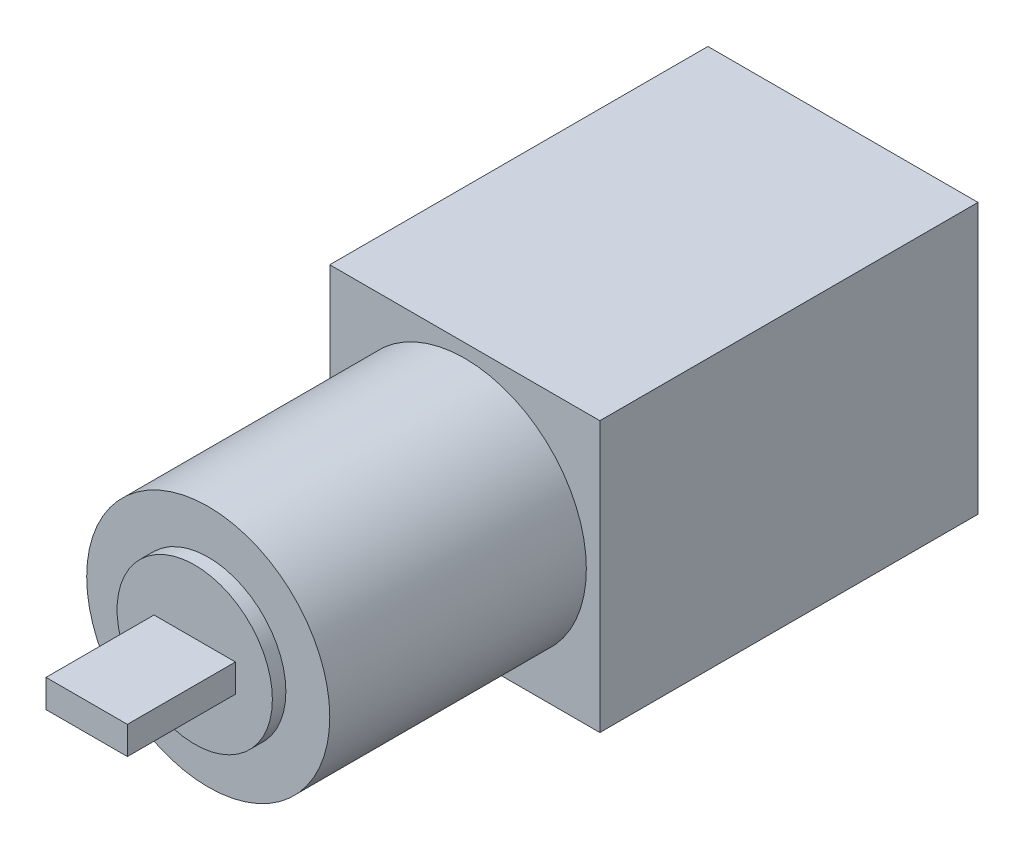
ISO-10303-21;
HEADER;
FILE_DESCRIPTION(('STEP AP214'),'2;1');
FILE_NAME('part.step','',(''),(''),'','','');
FILE_SCHEMA(('AUTOMOTIVE_DESIGN { 1 0 10303 214 1 1 1 1 }'));
ENDSEC;
DATA;
#1=APPLICATION_CONTEXT('core data for automotive mechanical design processes');
#2=APPLICATION_PROTOCOL_DEFINITION('international standard','automotive_design',2000,#1);
#3=PRODUCT_CONTEXT('',#1,'mechanical');
#4=PRODUCT('Part','Part','',(#3));
#5=PRODUCT_RELATED_PRODUCT_CATEGORY('part','',(#4));
#6=PRODUCT_DEFINITION_FORMATION('','',#4);
#7=PRODUCT_DEFINITION_CONTEXT('part definition',#1,'design');
#8=PRODUCT_DEFINITION('design','',#6,#7);
#9=PRODUCT_DEFINITION_SHAPE('','',#8);
#10=(LENGTH_UNIT() NAMED_UNIT(*) SI_UNIT(.MILLI.,.METRE.));
#11=(NAMED_UNIT(*) PLANE_ANGLE_UNIT() SI_UNIT($,.RADIAN.));
#12=(NAMED_UNIT(*) SI_UNIT($,.STERADIAN.) SOLID_ANGLE_UNIT());
#13=UNCERTAINTY_MEASURE_WITH_UNIT(LENGTH_MEASURE(1.E-05),#10,'distance_accuracy_value','');
#14=(GEOMETRIC_REPRESENTATION_CONTEXT(3) GLOBAL_UNCERTAINTY_ASSIGNED_CONTEXT((#13)) GLOBAL_UNIT_ASSIGNED_CONTEXT((#10,
#11,#12)) REPRESENTATION_CONTEXT('',''));
#15=CARTESIAN_POINT('',(0.,0.,0.));
#16=DIRECTION('',(0.,0.,1.));
#17=DIRECTION('',(1.,0.,0.));
#18=AXIS2_PLACEMENT_3D('',#15,#16,#17);
#19=CARTESIAN_POINT('',(0.,0.,56.));
#20=DIRECTION('',(1.,0.,0.));
#21=DIRECTION('',(0.,1.,0.));
#22=AXIS2_PLACEMENT_3D('',#19,#20,#21);
#23=PLANE('',#22);
#24=DIRECTION('',(0.,-1.,0.));
#25=VECTOR('',#24,1.);
#26=CARTESIAN_POINT('',(0.,0.,0.));
#27=LINE('',#26,#25);
#28=CARTESIAN_POINT('',(0.,40.,0.));
#29=VERTEX_POINT('',#28);
#30=CARTESIAN_POINT('',(0.,0.,0.));
#31=VERTEX_POINT('',#30);
#32=EDGE_CURVE('E145',#29,#31,#27,.T.);
#33=ORIENTED_EDGE('',*,*,#32,.T.);
#34=DIRECTION('',(0.,0.,-1.));
#35=VECTOR('',#34,1.);
#36=CARTESIAN_POINT('',(0.,0.,56.));
#37=LINE('',#36,#35);
#38=CARTESIAN_POINT('',(0.,0.,56.));
#39=VERTEX_POINT('',#38);
#40=EDGE_CURVE('E44',#39,#31,#37,.T.);
#41=ORIENTED_EDGE('',*,*,#40,.F.);
#42=DIRECTION('',(0.,-1.,0.));
#43=VECTOR('',#42,1.);
#44=CARTESIAN_POINT('',(0.,0.,56.));
#45=LINE('',#44,#43);
#46=CARTESIAN_POINT('',(0.,40.,56.));
#47=VERTEX_POINT('',#46);
#48=EDGE_CURVE('E149',#47,#39,#45,.T.);
#49=ORIENTED_EDGE('',*,*,#48,.F.);
#50=DIRECTION('',(0.,0.,-1.));
#51=VECTOR('',#50,1.);
#52=CARTESIAN_POINT('',(0.,40.,56.));
#53=LINE('',#52,#51);
#54=EDGE_CURVE('E163',#47,#29,#53,.T.);
#55=ORIENTED_EDGE('',*,*,#54,.T.);
#56=EDGE_LOOP('',(#33,#41,#49,#55));
#57=FACE_BOUND('',#56,.T.);
#58=ADVANCED_FACE('F41',(#57),#23,.F.);
#59=CARTESIAN_POINT('',(0.,0.,56.));
#60=DIRECTION('',(0.,1.,0.));
#61=DIRECTION('',(0.,0.,1.));
#62=AXIS2_PLACEMENT_3D('',#59,#60,#61);
#63=PLANE('',#62);
#64=DIRECTION('',(1.,0.,0.));
#65=VECTOR('',#64,1.);
#66=CARTESIAN_POINT('',(0.,0.,0.));
#67=LINE('',#66,#65);
#68=CARTESIAN_POINT('',(40.,0.,0.));
#69=VERTEX_POINT('',#68);
#70=EDGE_CURVE('E167',#31,#69,#67,.T.);
#71=ORIENTED_EDGE('',*,*,#70,.T.);
#72=DIRECTION('',(0.,0.,-1.));
#73=VECTOR('',#72,1.);
#74=CARTESIAN_POINT('',(40.,0.,56.));
#75=LINE('',#74,#73);
#76=CARTESIAN_POINT('',(40.,0.,56.));
#77=VERTEX_POINT('',#76);
#78=EDGE_CURVE('E181',#77,#69,#75,.T.);
#79=ORIENTED_EDGE('',*,*,#78,.F.);
#80=DIRECTION('',(1.,0.,0.));
#81=VECTOR('',#80,1.);
#82=CARTESIAN_POINT('',(0.,0.,56.));
#83=LINE('',#82,#81);
#84=EDGE_CURVE('E153',#39,#77,#83,.T.);
#85=ORIENTED_EDGE('',*,*,#84,.F.);
#86=ORIENTED_EDGE('',*,*,#40,.T.);
#87=EDGE_LOOP('',(#71,#79,#85,#86));
#88=FACE_BOUND('',#87,.T.);
#89=ADVANCED_FACE('F192',(#88),#63,.F.);
#90=CARTESIAN_POINT('',(40.,0.,56.));
#91=DIRECTION('',(-1.,0.,0.));
#92=DIRECTION('',(0.,-1.,0.));
#93=AXIS2_PLACEMENT_3D('',#90,#91,#92);
#94=PLANE('',#93);
#95=DIRECTION('',(0.,1.,0.));
#96=VECTOR('',#95,1.);
#97=CARTESIAN_POINT('',(40.,0.,0.));
#98=LINE('',#97,#96);
#99=CARTESIAN_POINT('',(40.,40.,0.));
#100=VERTEX_POINT('',#99);
#101=EDGE_CURVE('E170',#69,#100,#98,.T.);
#102=ORIENTED_EDGE('',*,*,#101,.T.);
#103=DIRECTION('',(0.,0.,-1.));
#104=VECTOR('',#103,1.);
#105=CARTESIAN_POINT('',(40.,40.,56.));
#106=LINE('',#105,#104);
#107=CARTESIAN_POINT('',(40.,40.,56.));
#108=VERTEX_POINT('',#107);
#109=EDGE_CURVE('E178',#108,#100,#106,.T.);
#110=ORIENTED_EDGE('',*,*,#109,.F.);
#111=DIRECTION('',(0.,1.,0.));
#112=VECTOR('',#111,1.);
#113=CARTESIAN_POINT('',(40.,0.,56.));
#114=LINE('',#113,#112);
#115=EDGE_CURVE('E157',#77,#108,#114,.T.);
#116=ORIENTED_EDGE('',*,*,#115,.F.);
#117=ORIENTED_EDGE('',*,*,#78,.T.);
#118=EDGE_LOOP('',(#102,#110,#116,#117));
#119=FACE_BOUND('',#118,.T.);
#120=ADVANCED_FACE('F201',(#119),#94,.F.);
#121=CARTESIAN_POINT('',(0.,40.,56.));
#122=DIRECTION('',(0.,-1.,0.));
#123=DIRECTION('',(0.,0.,-1.));
#124=AXIS2_PLACEMENT_3D('',#121,#122,#123);
#125=PLANE('',#124);
#126=DIRECTION('',(-1.,0.,0.));
#127=VECTOR('',#126,1.);
#128=CARTESIAN_POINT('',(0.,40.,0.));
#129=LINE('',#128,#127);
#130=EDGE_CURVE('E154',#100,#29,#129,.T.);
#131=ORIENTED_EDGE('',*,*,#130,.T.);
#132=ORIENTED_EDGE('',*,*,#54,.F.);
#133=DIRECTION('',(-1.,0.,0.));
#134=VECTOR('',#133,1.);
#135=CARTESIAN_POINT('',(0.,40.,56.));
#136=LINE('',#135,#134);
#137=EDGE_CURVE('E160',#108,#47,#136,.T.);
#138=ORIENTED_EDGE('',*,*,#137,.F.);
#139=ORIENTED_EDGE('',*,*,#109,.T.);
#140=EDGE_LOOP('',(#131,#132,#138,#139));
#141=FACE_BOUND('',#140,.T.);
#142=ADVANCED_FACE('F204',(#141),#125,.F.);
#143=CARTESIAN_POINT('',(0.,0.,56.));
#144=DIRECTION('',(0.,0.,-1.));
#145=DIRECTION('',(-1.,0.,0.));
#146=AXIS2_PLACEMENT_3D('',#143,#144,#145);
#147=PLANE('',#146);
#148=CARTESIAN_POINT('',(20.,20.,56.));
#149=DIRECTION('',(0.,0.,1.));
#150=DIRECTION('',(1.,0.,0.));
#151=AXIS2_PLACEMENT_3D('',#148,#149,#150);
#152=CIRCLE('',#151,18.);
#153=CARTESIAN_POINT('',(38.,20.,56.));
#154=VERTEX_POINT('',#153);
#155=EDGE_CURVE('E50',#154,#154,#152,.T.);
#156=ORIENTED_EDGE('',*,*,#155,.F.);
#157=EDGE_LOOP('',(#156));
#158=FACE_BOUND('',#157,.T.);
#159=ORIENTED_EDGE('',*,*,#48,.T.);
#160=ORIENTED_EDGE('',*,*,#84,.T.);
#161=ORIENTED_EDGE('',*,*,#115,.T.);
#162=ORIENTED_EDGE('',*,*,#137,.T.);
#163=EDGE_LOOP('',(#159,#160,#161,#162));
#164=FACE_BOUND('',#163,.T.);
#165=ADVANCED_FACE('F206',(#158,#164),#147,.F.);
#166=CARTESIAN_POINT('',(0.,0.,0.));
#167=DIRECTION('',(0.,0.,-1.));
#168=DIRECTION('',(-1.,0.,0.));
#169=AXIS2_PLACEMENT_3D('',#166,#167,#168);
#170=PLANE('',#169);
#171=ORIENTED_EDGE('',*,*,#32,.F.);
#172=ORIENTED_EDGE('',*,*,#130,.F.);
#173=ORIENTED_EDGE('',*,*,#101,.F.);
#174=ORIENTED_EDGE('',*,*,#70,.F.);
#175=EDGE_LOOP('',(#171,#172,#173,#174));
#176=FACE_BOUND('',#175,.T.);
#177=ADVANCED_FACE('F199',(#176),#170,.T.);
#178=CARTESIAN_POINT('',(20.,20.,94.));
#179=DIRECTION('',(0.,0.,-1.));
#180=DIRECTION('',(-1.,0.,0.));
#181=AXIS2_PLACEMENT_3D('',#178,#179,#180);
#182=CYLINDRICAL_SURFACE('',#181,18.);
#183=CARTESIAN_POINT('',(20.,20.,94.));
#184=DIRECTION('',(0.,0.,1.));
#185=DIRECTION('',(1.,0.,0.));
#186=AXIS2_PLACEMENT_3D('',#183,#184,#185);
#187=CIRCLE('',#186,18.);
#188=CARTESIAN_POINT('',(38.,20.,94.));
#189=VERTEX_POINT('',#188);
#190=EDGE_CURVE('E136',#189,#189,#187,.T.);
#191=ORIENTED_EDGE('',*,*,#190,.F.);
#192=EDGE_LOOP('',(#191));
#193=FACE_BOUND('',#192,.T.);
#194=ORIENTED_EDGE('',*,*,#155,.T.);
#195=EDGE_LOOP('',(#194));
#196=FACE_BOUND('',#195,.T.);
#197=ADVANCED_FACE('F214',(#193,#196),#182,.T.);
#198=CARTESIAN_POINT('',(20.,20.,94.));
#199=DIRECTION('',(0.,0.,1.));
#200=DIRECTION('',(1.,0.,0.));
#201=AXIS2_PLACEMENT_3D('',#198,#199,#200);
#202=PLANE('',#201);
#203=CARTESIAN_POINT('',(20.,20.,94.));
#204=DIRECTION('',(0.,0.,1.));
#205=DIRECTION('',(1.,0.,0.));
#206=AXIS2_PLACEMENT_3D('',#203,#204,#205);
#207=CIRCLE('',#206,11.5);
#208=CARTESIAN_POINT('',(31.5,20.,94.));
#209=VERTEX_POINT('',#208);
#210=EDGE_CURVE('E11',#209,#209,#207,.T.);
#211=ORIENTED_EDGE('',*,*,#210,.F.);
#212=EDGE_LOOP('',(#211));
#213=FACE_BOUND('',#212,.T.);
#214=ORIENTED_EDGE('',*,*,#190,.T.);
#215=EDGE_LOOP('',(#214));
#216=FACE_BOUND('',#215,.T.);
#217=ADVANCED_FACE('F252',(#213,#216),#202,.T.);
#218=CARTESIAN_POINT('',(20.,20.,96.));
#219=DIRECTION('',(0.,0.,-1.));
#220=DIRECTION('',(-1.,0.,0.));
#221=AXIS2_PLACEMENT_3D('',#218,#219,#220);
#222=CYLINDRICAL_SURFACE('',#221,11.5);
#223=CARTESIAN_POINT('',(20.,20.,96.));
#224=DIRECTION('',(0.,0.,1.));
#225=DIRECTION('',(1.,0.,0.));
#226=AXIS2_PLACEMENT_3D('',#223,#224,#225);
#227=CIRCLE('',#226,11.5);
#228=CARTESIAN_POINT('',(31.5,20.,96.));
#229=VERTEX_POINT('',#228);
#230=EDGE_CURVE('E131',#229,#229,#227,.T.);
#231=ORIENTED_EDGE('',*,*,#230,.F.);
#232=EDGE_LOOP('',(#231));
#233=FACE_BOUND('',#232,.T.);
#234=ORIENTED_EDGE('',*,*,#210,.T.);
#235=EDGE_LOOP('',(#234));
#236=FACE_BOUND('',#235,.T.);
#237=ADVANCED_FACE('F261',(#233,#236),#222,.T.);
#238=CARTESIAN_POINT('',(20.,20.,96.));
#239=DIRECTION('',(0.,0.,1.));
#240=DIRECTION('',(1.,0.,0.));
#241=AXIS2_PLACEMENT_3D('',#238,#239,#240);
#242=PLANE('',#241);
#243=DIRECTION('',(0.,-1.,0.));
#244=VECTOR('',#243,1.);
#245=CARTESIAN_POINT('',(13.9749023518657,22.0683171030913,96.));
#246=LINE('',#245,#244);
#247=CARTESIAN_POINT('',(13.9749023518657,22.0683171030913,96.));
#248=VERTEX_POINT('',#247);
#249=CARTESIAN_POINT('',(13.9749023518657,17.9316828969087,96.));
#250=VERTEX_POINT('',#249);
#251=EDGE_CURVE('E58',#248,#250,#246,.T.);
#252=ORIENTED_EDGE('',*,*,#251,.F.);
#253=DIRECTION('',(-1.,0.,0.));
#254=VECTOR('',#253,1.);
#255=CARTESIAN_POINT('',(13.9749023518657,22.0683171030913,96.));
#256=LINE('',#255,#254);
#257=CARTESIAN_POINT('',(26.0250976481343,22.0683171030913,96.));
#258=VERTEX_POINT('',#257);
#259=EDGE_CURVE('E62',#258,#248,#256,.T.);
#260=ORIENTED_EDGE('',*,*,#259,.F.);
#261=DIRECTION('',(0.,1.,0.));
#262=VECTOR('',#261,1.);
#263=CARTESIAN_POINT('',(26.0250976481343,22.0683171030913,96.));
#264=LINE('',#263,#262);
#265=CARTESIAN_POINT('',(26.0250976481343,17.9316828969087,96.));
#266=VERTEX_POINT('',#265);
#267=EDGE_CURVE('E332',#266,#258,#264,.T.);
#268=ORIENTED_EDGE('',*,*,#267,.F.);
#269=DIRECTION('',(1.,0.,0.));
#270=VECTOR('',#269,1.);
#271=CARTESIAN_POINT('',(13.9749023518657,17.9316828969087,96.));
#272=LINE('',#271,#270);
#273=EDGE_CURVE('E342',#250,#266,#272,.T.);
#274=ORIENTED_EDGE('',*,*,#273,.F.);
#275=EDGE_LOOP('',(#252,#260,#268,#274));
#276=FACE_BOUND('',#275,.T.);
#277=ORIENTED_EDGE('',*,*,#230,.T.);
#278=EDGE_LOOP('',(#277));
#279=FACE_BOUND('',#278,.T.);
#280=ADVANCED_FACE('F271',(#276,#279),#242,.T.);
#281=CARTESIAN_POINT('',(13.9749023518657,22.0683171030913,112.));
#282=DIRECTION('',(1.,0.,0.));
#283=DIRECTION('',(0.,0.,-1.));
#284=AXIS2_PLACEMENT_3D('',#281,#282,#283);
#285=PLANE('',#284);
#286=ORIENTED_EDGE('',*,*,#251,.T.);
#287=DIRECTION('',(0.,0.,-1.));
#288=VECTOR('',#287,1.);
#289=CARTESIAN_POINT('',(13.9749023518657,17.9316828969087,112.));
#290=LINE('',#289,#288);
#291=CARTESIAN_POINT('',(13.9749023518657,17.9316828969087,112.));
#292=VERTEX_POINT('',#291);
#293=EDGE_CURVE('E111',#292,#250,#290,.T.);
#294=ORIENTED_EDGE('',*,*,#293,.F.);
#295=DIRECTION('',(0.,-1.,0.));
#296=VECTOR('',#295,1.);
#297=CARTESIAN_POINT('',(13.9749023518657,22.0683171030913,112.));
#298=LINE('',#297,#296);
#299=CARTESIAN_POINT('',(13.9749023518657,22.0683171030913,112.));
#300=VERTEX_POINT('',#299);
#301=EDGE_CURVE('E118',#300,#292,#298,.T.);
#302=ORIENTED_EDGE('',*,*,#301,.F.);
#303=DIRECTION('',(0.,0.,-1.));
#304=VECTOR('',#303,1.);
#305=CARTESIAN_POINT('',(13.9749023518657,22.0683171030913,112.));
#306=LINE('',#305,#304);
#307=EDGE_CURVE('E329',#300,#248,#306,.T.);
#308=ORIENTED_EDGE('',*,*,#307,.T.);
#309=EDGE_LOOP('',(#286,#294,#302,#308));
#310=FACE_BOUND('',#309,.T.);
#311=ADVANCED_FACE('F129',(#310),#285,.F.);
#312=CARTESIAN_POINT('',(13.9749023518657,17.9316828969087,112.));
#313=DIRECTION('',(0.,1.,0.));
#314=DIRECTION('',(0.,0.,1.));
#315=AXIS2_PLACEMENT_3D('',#312,#313,#314);
#316=PLANE('',#315);
#317=ORIENTED_EDGE('',*,*,#273,.T.);
#318=DIRECTION('',(0.,0.,-1.));
#319=VECTOR('',#318,1.);
#320=CARTESIAN_POINT('',(26.0250976481343,17.9316828969087,112.));
#321=LINE('',#320,#319);
#322=CARTESIAN_POINT('',(26.0250976481343,17.9316828969087,112.));
#323=VERTEX_POINT('',#322);
#324=EDGE_CURVE('E113',#323,#266,#321,.T.);
#325=ORIENTED_EDGE('',*,*,#324,.F.);
#326=DIRECTION('',(1.,0.,0.));
#327=VECTOR('',#326,1.);
#328=CARTESIAN_POINT('',(13.9749023518657,17.9316828969087,112.));
#329=LINE('',#328,#327);
#330=EDGE_CURVE('E106',#292,#323,#329,.T.);
#331=ORIENTED_EDGE('',*,*,#330,.F.);
#332=ORIENTED_EDGE('',*,*,#293,.T.);
#333=EDGE_LOOP('',(#317,#325,#331,#332));
#334=FACE_BOUND('',#333,.T.);
#335=ADVANCED_FACE('F109',(#334),#316,.F.);
#336=CARTESIAN_POINT('',(26.0250976481343,22.0683171030913,112.));
#337=DIRECTION('',(-1.,0.,0.));
#338=DIRECTION('',(0.,0.,1.));
#339=AXIS2_PLACEMENT_3D('',#336,#337,#338);
#340=PLANE('',#339);
#341=ORIENTED_EDGE('',*,*,#267,.T.);
#342=DIRECTION('',(0.,0.,-1.));
#343=VECTOR('',#342,1.);
#344=CARTESIAN_POINT('',(26.0250976481343,22.0683171030913,112.));
#345=LINE('',#344,#343);
#346=CARTESIAN_POINT('',(26.0250976481343,22.0683171030913,112.));
#347=VERTEX_POINT('',#346);
#348=EDGE_CURVE('E138',#347,#258,#345,.T.);
#349=ORIENTED_EDGE('',*,*,#348,.F.);
#350=DIRECTION('',(0.,1.,0.));
#351=VECTOR('',#350,1.);
#352=CARTESIAN_POINT('',(26.0250976481343,22.0683171030913,112.));
#353=LINE('',#352,#351);
#354=EDGE_CURVE('E117',#323,#347,#353,.T.);
#355=ORIENTED_EDGE('',*,*,#354,.F.);
#356=ORIENTED_EDGE('',*,*,#324,.T.);
#357=EDGE_LOOP('',(#341,#349,#355,#356));
#358=FACE_BOUND('',#357,.T.);
#359=ADVANCED_FACE('F297',(#358),#340,.F.);
#360=CARTESIAN_POINT('',(13.9749023518657,22.0683171030913,112.));
#361=DIRECTION('',(0.,-1.,0.));
#362=DIRECTION('',(0.,0.,-1.));
#363=AXIS2_PLACEMENT_3D('',#360,#361,#362);
#364=PLANE('',#363);
#365=ORIENTED_EDGE('',*,*,#259,.T.);
#366=ORIENTED_EDGE('',*,*,#307,.F.);
#367=DIRECTION('',(-1.,0.,0.));
#368=VECTOR('',#367,1.);
#369=CARTESIAN_POINT('',(13.9749023518657,22.0683171030913,112.));
#370=LINE('',#369,#368);
#371=EDGE_CURVE('E123',#347,#300,#370,.T.);
#372=ORIENTED_EDGE('',*,*,#371,.F.);
#373=ORIENTED_EDGE('',*,*,#348,.T.);
#374=EDGE_LOOP('',(#365,#366,#372,#373));
#375=FACE_BOUND('',#374,.T.);
#376=ADVANCED_FACE('F306',(#375),#364,.F.);
#377=CARTESIAN_POINT('',(0.,0.,112.));
#378=DIRECTION('',(0.,0.,1.));
#379=DIRECTION('',(1.,0.,0.));
#380=AXIS2_PLACEMENT_3D('',#377,#378,#379);
#381=PLANE('',#380);
#382=ORIENTED_EDGE('',*,*,#301,.T.);
#383=ORIENTED_EDGE('',*,*,#330,.T.);
#384=ORIENTED_EDGE('',*,*,#354,.T.);
#385=ORIENTED_EDGE('',*,*,#371,.T.);
#386=EDGE_LOOP('',(#382,#383,#384,#385));
#387=FACE_BOUND('',#386,.T.);
#388=ADVANCED_FACE('F121',(#387),#381,.T.);
#389=CLOSED_SHELL('',(#58,#89,#120,#142,#165,#177,#197,#217,#237,#280,#311,#335,#359,#376,#388));
#390=MANIFOLD_SOLID_BREP('B2',#389);
#391=ADVANCED_BREP_SHAPE_REPRESENTATION('',(#18,#390),#14);
#392=SHAPE_DEFINITION_REPRESENTATION(#9,#391);
ENDSEC;
END-ISO-10303-21;
